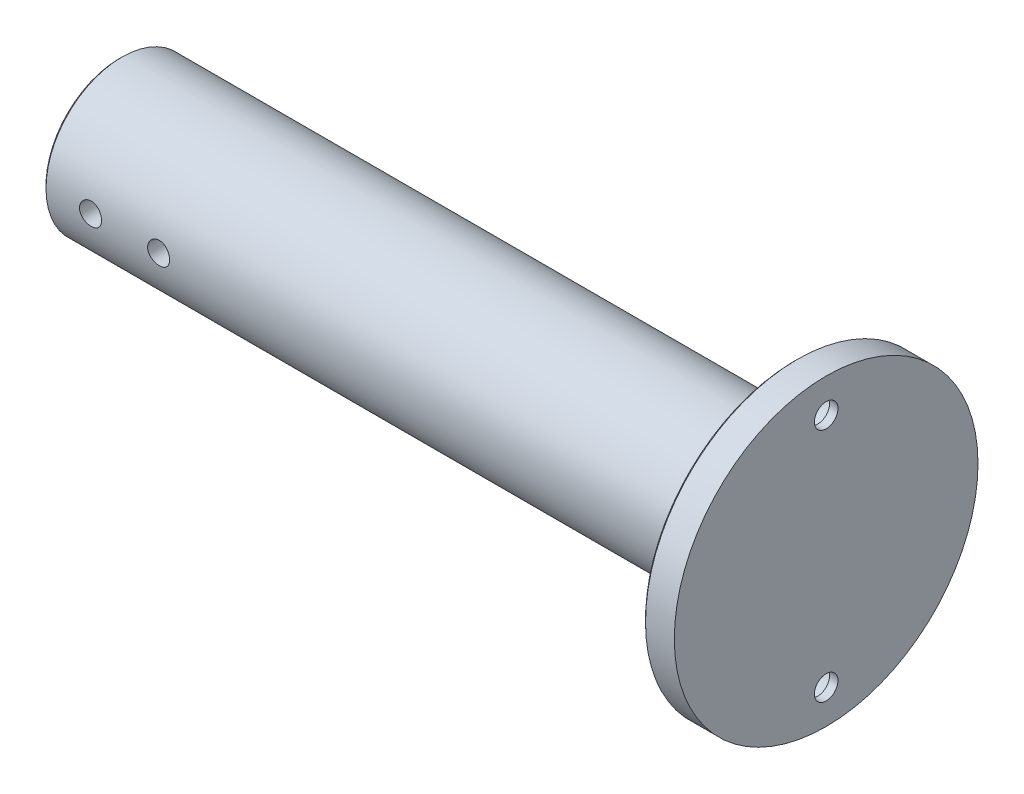
ISO-10303-21;
HEADER;
FILE_DESCRIPTION(('STEP AP214'),'2;1');
FILE_NAME('part.step','',(''),(''),'','','');
FILE_SCHEMA(('AUTOMOTIVE_DESIGN { 1 0 10303 214 1 1 1 1 }'));
ENDSEC;
DATA;
#1=APPLICATION_CONTEXT('core data for automotive mechanical design processes');
#2=APPLICATION_PROTOCOL_DEFINITION('international standard','automotive_design',2000,#1);
#3=PRODUCT_CONTEXT('',#1,'mechanical');
#4=PRODUCT('Part','Part','',(#3));
#5=PRODUCT_RELATED_PRODUCT_CATEGORY('part','',(#4));
#6=PRODUCT_DEFINITION_FORMATION('','',#4);
#7=PRODUCT_DEFINITION_CONTEXT('part definition',#1,'design');
#8=PRODUCT_DEFINITION('design','',#6,#7);
#9=PRODUCT_DEFINITION_SHAPE('','',#8);
#10=(LENGTH_UNIT() NAMED_UNIT(*) SI_UNIT(.MILLI.,.METRE.));
#11=(NAMED_UNIT(*) PLANE_ANGLE_UNIT() SI_UNIT($,.RADIAN.));
#12=(NAMED_UNIT(*) SI_UNIT($,.STERADIAN.) SOLID_ANGLE_UNIT());
#13=UNCERTAINTY_MEASURE_WITH_UNIT(LENGTH_MEASURE(1.E-05),#10,'distance_accuracy_value','');
#14=(GEOMETRIC_REPRESENTATION_CONTEXT(3) GLOBAL_UNCERTAINTY_ASSIGNED_CONTEXT((#13)) GLOBAL_UNIT_ASSIGNED_CONTEXT((#10,
#11,#12)) REPRESENTATION_CONTEXT('',''));
#15=CARTESIAN_POINT('',(0.,0.,0.));
#16=DIRECTION('',(0.,0.,1.));
#17=DIRECTION('',(1.,0.,0.));
#18=AXIS2_PLACEMENT_3D('',#15,#16,#17);
#19=CARTESIAN_POINT('',(0.,0.,0.));
#20=DIRECTION('',(-1.,0.,0.));
#21=DIRECTION('',(0.,0.,1.));
#22=AXIS2_PLACEMENT_3D('',#19,#20,#21);
#23=CYLINDRICAL_SURFACE('',#22,7.);
#24=CARTESIAN_POINT('',(30.,0.,0.));
#25=DIRECTION('',(1.,0.,0.));
#26=DIRECTION('',(0.,0.,-1.));
#27=AXIS2_PLACEMENT_3D('',#24,#25,#26);
#28=CIRCLE('',#27,7.);
#29=CARTESIAN_POINT('',(30.,2.5,6.53834841531101));
#30=VERTEX_POINT('',#29);
#31=CARTESIAN_POINT('',(30.,-2.5,6.53834841531101));
#32=VERTEX_POINT('',#31);
#33=EDGE_CURVE('E92',#30,#32,#28,.T.);
#34=ORIENTED_EDGE('',*,*,#33,.F.);
#35=DIRECTION('',(-1.,0.,0.));
#36=VECTOR('',#35,1.);
#37=CARTESIAN_POINT('',(30.,2.5,6.53834841531101));
#38=LINE('',#37,#36);
#39=CARTESIAN_POINT('',(0.,2.5,6.53834841531101));
#40=VERTEX_POINT('',#39);
#41=EDGE_CURVE('E117',#30,#40,#38,.T.);
#42=ORIENTED_EDGE('',*,*,#41,.T.);
#43=CARTESIAN_POINT('',(0.,0.,0.));
#44=DIRECTION('',(-1.,0.,0.));
#45=DIRECTION('',(0.,0.,1.));
#46=AXIS2_PLACEMENT_3D('',#43,#44,#45);
#47=CIRCLE('',#46,7.);
#48=CARTESIAN_POINT('',(0.,-2.5,6.53834841531101));
#49=VERTEX_POINT('',#48);
#50=EDGE_CURVE('E106',#40,#49,#47,.T.);
#51=ORIENTED_EDGE('',*,*,#50,.T.);
#52=DIRECTION('',(-1.,0.,0.));
#53=VECTOR('',#52,1.);
#54=CARTESIAN_POINT('',(30.,-2.5,6.53834841531101));
#55=LINE('',#54,#53);
#56=EDGE_CURVE('E59',#32,#49,#55,.T.);
#57=ORIENTED_EDGE('',*,*,#56,.F.);
#58=EDGE_LOOP('',(#34,#42,#51,#57));
#59=FACE_BOUND('',#58,.T.);
#60=CARTESIAN_POINT('',(32.,0.,0.));
#61=DIRECTION('',(-1.,0.,0.));
#62=DIRECTION('',(0.,0.,1.));
#63=AXIS2_PLACEMENT_3D('',#60,#61,#62);
#64=CIRCLE('',#63,7.);
#65=CARTESIAN_POINT('',(32.,0.,7.));
#66=VERTEX_POINT('',#65);
#67=EDGE_CURVE('E113',#66,#66,#64,.T.);
#68=ORIENTED_EDGE('',*,*,#67,.F.);
#69=EDGE_LOOP('',(#68));
#70=FACE_BOUND('',#69,.T.);
#71=ADVANCED_FACE('F38',(#59,#70),#23,.F.);
#72=CARTESIAN_POINT('',(0.,7.,0.));
#73=DIRECTION('',(1.,0.,0.));
#74=DIRECTION('',(0.,0.,-1.));
#75=AXIS2_PLACEMENT_3D('',#72,#73,#74);
#76=PLANE('',#75);
#77=CARTESIAN_POINT('',(0.,0.,0.));
#78=DIRECTION('',(1.,0.,0.));
#79=DIRECTION('',(0.,0.,-1.));
#80=AXIS2_PLACEMENT_3D('',#77,#78,#79);
#81=CIRCLE('',#80,14.);
#82=CARTESIAN_POINT('',(0.,0.,-14.));
#83=VERTEX_POINT('',#82);
#84=EDGE_CURVE('E51',#83,#83,#81,.F.);
#85=ORIENTED_EDGE('',*,*,#84,.T.);
#86=EDGE_LOOP('',(#85));
#87=FACE_BOUND('',#86,.T.);
#88=ORIENTED_EDGE('',*,*,#50,.F.);
#89=DIRECTION('',(0.,0.,-1.));
#90=VECTOR('',#89,1.);
#91=CARTESIAN_POINT('',(0.,2.5,6.53834841531101));
#92=LINE('',#91,#90);
#93=CARTESIAN_POINT('',(0.,2.5,9.3));
#94=VERTEX_POINT('',#93);
#95=EDGE_CURVE('E101',#94,#40,#92,.T.);
#96=ORIENTED_EDGE('',*,*,#95,.F.);
#97=DIRECTION('',(0.,1.,0.));
#98=VECTOR('',#97,1.);
#99=CARTESIAN_POINT('',(0.,2.5,9.3));
#100=LINE('',#99,#98);
#101=CARTESIAN_POINT('',(0.,-2.5,9.3));
#102=VERTEX_POINT('',#101);
#103=EDGE_CURVE('E255',#102,#94,#100,.T.);
#104=ORIENTED_EDGE('',*,*,#103,.F.);
#105=DIRECTION('',(0.,0.,1.));
#106=VECTOR('',#105,1.);
#107=CARTESIAN_POINT('',(0.,-2.5,6.53834841531101));
#108=LINE('',#107,#106);
#109=EDGE_CURVE('E160',#49,#102,#108,.T.);
#110=ORIENTED_EDGE('',*,*,#109,.F.);
#111=EDGE_LOOP('',(#88,#96,#104,#110));
#112=FACE_BOUND('',#111,.T.);
#113=ADVANCED_FACE('F214',(#87,#112),#76,.F.);
#114=CARTESIAN_POINT('',(0.,0.,0.));
#115=DIRECTION('',(-1.,0.,0.));
#116=DIRECTION('',(0.,0.,1.));
#117=AXIS2_PLACEMENT_3D('',#114,#115,#116);
#118=CYLINDRICAL_SURFACE('',#117,14.5);
#119=CARTESIAN_POINT('',(11.1,0.,14.5));
#120=CARTESIAN_POINT('',(11.0999951275572,-0.117299613270332,14.4999981660736));
#121=CARTESIAN_POINT('',(11.0901388300823,-0.23466845337473,14.4985616918919));
#122=CARTESIAN_POINT('',(11.0509821928534,-0.46612874531889,14.4929695432408));
#123=CARTESIAN_POINT('',(11.0216626168246,-0.580216838173616,14.4888111786838));
#124=CARTESIAN_POINT('',(10.9444711328522,-0.801732181673342,14.4782428121584));
#125=CARTESIAN_POINT('',(10.8966129096789,-0.909164277915187,14.4718344713926));
#126=CARTESIAN_POINT('',(10.7837353517035,-1.11445541814673,14.4574752908817));
#127=CARTESIAN_POINT('',(10.7187185234473,-1.21231585751398,14.4495246764784));
#128=CARTESIAN_POINT('',(10.5728630974437,-1.39641774437003,14.4329009407888));
#129=CARTESIAN_POINT('',(10.4919239814391,-1.48257916896793,14.4242234416085));
#130=CARTESIAN_POINT('',(10.3167377866319,-1.64014705545175,14.4071584354515));
#131=CARTESIAN_POINT('',(10.2224899631583,-1.71155269114603,14.3987709447345));
#132=CARTESIAN_POINT('',(10.022827717683,-1.83789075681519,14.3831930506778));
#133=CARTESIAN_POINT('',(9.91736415206087,-1.89274627894392,14.3760083031656));
#134=CARTESIAN_POINT('',(9.69859929764127,-1.98393556632179,14.3637087777007));
#135=CARTESIAN_POINT('',(9.58529840720676,-2.02027027217996,14.3585938946294));
#136=CARTESIAN_POINT('',(9.35491450948957,-2.07313910873064,14.3510560435368));
#137=CARTESIAN_POINT('',(9.23786347371861,-2.08980986517223,14.3486145096159));
#138=CARTESIAN_POINT('',(9.00260179321826,-2.10330072907034,14.3466433490983));
#139=CARTESIAN_POINT('',(8.88439121096332,-2.10012190018772,14.3471135664724));
#140=CARTESIAN_POINT('',(8.65112824724246,-2.07411559063177,14.3508957977387));
#141=CARTESIAN_POINT('',(8.53605853521923,-2.05143990441475,14.3541858568831));
#142=CARTESIAN_POINT('',(8.31137462795344,-1.98732100540721,14.3632027837136));
#143=CARTESIAN_POINT('',(8.20176057752362,-1.94587729474084,14.3689297160446));
#144=CARTESIAN_POINT('',(7.99063554014074,-1.84523974296827,14.3821995060398));
#145=CARTESIAN_POINT('',(7.88915580814736,-1.78598123809014,14.3897489590468));
#146=CARTESIAN_POINT('',(7.69752298511232,-1.65144232517843,14.4058083242372));
#147=CARTESIAN_POINT('',(7.60737058829275,-1.57616093590606,14.4143182952277));
#148=CARTESIAN_POINT('',(7.44007148894477,-1.41087821383593,14.4314369801912));
#149=CARTESIAN_POINT('',(7.36305375539077,-1.32074629825182,14.4400458755576));
#150=CARTESIAN_POINT('',(7.22521880647849,-1.12876709993728,14.4563186729003));
#151=CARTESIAN_POINT('',(7.1644016536433,-1.02691977199559,14.4639825712296));
#152=CARTESIAN_POINT('',(7.06068906522607,-0.814291764442148,14.4775090984612));
#153=CARTESIAN_POINT('',(7.01780316447181,-0.703506369325372,14.4833707686031));
#154=CARTESIAN_POINT('',(6.95128040873683,-0.47620239154794,14.4926242487035));
#155=CARTESIAN_POINT('',(6.9276423414137,-0.359684170464868,14.4960162142172));
#156=CARTESIAN_POINT('',(6.9004567819414,-0.125335604900574,14.4999275875031));
#157=CARTESIAN_POINT('',(6.89673190622403,-0.00752624522528646,14.500472356672));
#158=CARTESIAN_POINT('',(6.90900823510813,0.227035329333205,14.4986968687047));
#159=CARTESIAN_POINT('',(6.92500887157522,0.343787574565868,14.4963766940845));
#160=CARTESIAN_POINT('',(6.97613454686024,0.572386528792875,14.489147713708));
#161=CARTESIAN_POINT('',(7.01117357225349,0.684252874322393,14.4842505536124));
#162=CARTESIAN_POINT('',(7.09929097510943,0.900522807854554,14.4724151045888));
#163=CARTESIAN_POINT('',(7.15237014952721,1.00492606591561,14.4654767254882));
#164=CARTESIAN_POINT('',(7.27548015466707,1.20408891460967,14.4502673157442));
#165=CARTESIAN_POINT('',(7.34562400020878,1.29877796574594,14.4419875287991));
#166=CARTESIAN_POINT('',(7.50071431934693,1.47510343140294,14.4250452595269));
#167=CARTESIAN_POINT('',(7.58566159199609,1.55673914087991,14.4163827565605));
#168=CARTESIAN_POINT('',(7.76873531598681,1.70528248409736,14.3995714266397));
#169=CARTESIAN_POINT('',(7.86695848978308,1.77207149526099,14.3914270838224));
#170=CARTESIAN_POINT('',(8.07333353635115,1.88820213692189,14.3766523959015));
#171=CARTESIAN_POINT('',(8.18148515531277,1.93754421327522,14.3700220121103));
#172=CARTESIAN_POINT('',(8.40428693811768,2.01719466458259,14.3590580349442));
#173=CARTESIAN_POINT('',(8.51891404173257,2.0475664464087,14.3547167979207));
#174=CARTESIAN_POINT('',(8.75170932656402,2.08861654390681,14.3488019811722));
#175=CARTESIAN_POINT('',(8.86987728070567,2.09929611970574,14.3472282243531));
#176=CARTESIAN_POINT('',(9.10521810947313,2.10063018476802,14.3470328580372));
#177=CARTESIAN_POINT('',(9.22238994709194,2.09147114557779,14.348383758391));
#178=CARTESIAN_POINT('',(9.45350859749891,2.05378652523396,14.3538258929226));
#179=CARTESIAN_POINT('',(9.56745541409593,2.02526096695393,14.3579171238639));
#180=CARTESIAN_POINT('',(9.78884377137152,1.94971733785975,14.3683695747595));
#181=CARTESIAN_POINT('',(9.89628953205976,1.90271141502776,14.3747293032735));
#182=CARTESIAN_POINT('',(10.1017995426309,1.79155983241603,14.389004111718));
#183=CARTESIAN_POINT('',(10.1998635183729,1.72741367199679,14.3969192370776));
#184=CARTESIAN_POINT('',(10.3847750867278,1.58312168952411,14.413501720915));
#185=CARTESIAN_POINT('',(10.4715141943607,1.50283753040839,14.4221751892996));
#186=CARTESIAN_POINT('',(10.6303560357212,1.32884060733831,14.4392454083916));
#187=CARTESIAN_POINT('',(10.7024553535092,1.23512471800565,14.4476420941348));
#188=CARTESIAN_POINT('',(10.8302976268808,1.03636307286061,14.4632614439816));
#189=CARTESIAN_POINT('',(10.8859550450137,0.931261823785198,14.470477884142));
#190=CARTESIAN_POINT('',(10.9787453209441,0.713150267980082,14.4828623200179));
#191=CARTESIAN_POINT('',(11.0158975749304,0.600148384621874,14.488032459391));
#192=CARTESIAN_POINT('',(11.0620906821452,0.405517989833761,14.4945468165987));
#193=CARTESIAN_POINT('',(11.0762852422256,0.32509706575113,14.49658137891));
#194=CARTESIAN_POINT('',(11.0952415427288,0.163128581272512,14.4993086008408));
#195=CARTESIAN_POINT('',(11.1000033887487,0.0815810334991175,14.5000012754825));
#196=CARTESIAN_POINT('',(11.1,0.,14.5));
#197=B_SPLINE_CURVE_WITH_KNOTS('',3,(#119,#120,#121,#122,#123,#124,#125,#126,#127,#128,#129,
#130,#131,#132,#133,#134,#135,#136,#137,#138,#139,#140,#141,#142,#143,#144,#145,#146,#147,#148,
#149,#150,#151,#152,#153,#154,#155,#156,#157,#158,#159,#160,#161,#162,#163,#164,#165,#166,#167,
#168,#169,#170,#171,#172,#173,#174,#175,#176,#177,#178,#179,#180,#181,#182,#183,#184,#185,#186,
#187,#188,#189,#190,#191,#192,#193,#194,#195,#196),.UNSPECIFIED.,.T.,.F.,(4,2,2,2,2,2,2,2,2,2,2,
2,2,2,2,2,2,2,2,2,2,2,2,2,2,2,2,2,2,2,2,2,2,2,2,2,2,2,4),(0.,0.351600760363764,
0.703549539107828,1.05523901154347,1.40687713724447,1.76081086052436,2.11476439554727,
2.47033826754526,2.82589407936064,3.17896464735107,3.53201629584703,3.8823438658922,
4.23268072992844,4.5843049165824,4.93595064284241,5.29087191260946,5.64579455210848,
6.00090568015259,6.35599443946658,6.70791478822976,7.05982500121662,7.41015838316317,
7.76050724371122,8.1132427495233,8.46599730103469,8.82147636365635,9.1769463413611,
9.53122173680014,9.88547446096189,10.2364118733449,10.5873488712409,10.9380555669998,
11.2887725074718,11.6426349385295,11.9965798425742,12.3523349326982,12.7077163492759,
12.9522548752411,13.1967906636366),.UNSPECIFIED.);
#198=CARTESIAN_POINT('',(11.1,0.,14.5));
#199=VERTEX_POINT('',#198);
#200=EDGE_CURVE('E42',#199,#199,#197,.T.);
#201=ORIENTED_EDGE('',*,*,#200,.T.);
#202=EDGE_LOOP('',(#201));
#203=FACE_BOUND('',#202,.T.);
#204=CARTESIAN_POINT('',(24.1,0.,14.5));
#205=CARTESIAN_POINT('',(24.0999951275572,-0.117299613270333,14.4999981660736));
#206=CARTESIAN_POINT('',(24.0901388300823,-0.23466845337473,14.4985616918919));
#207=CARTESIAN_POINT('',(24.0509821928534,-0.466128745318891,14.4929695432408));
#208=CARTESIAN_POINT('',(24.0216626168246,-0.580216838173617,14.4888111786838));
#209=CARTESIAN_POINT('',(23.9444711328522,-0.801732181673344,14.4782428121584));
#210=CARTESIAN_POINT('',(23.8966129096789,-0.909164277915188,14.4718344713926));
#211=CARTESIAN_POINT('',(23.7837353517035,-1.11445541814673,14.4574752908817));
#212=CARTESIAN_POINT('',(23.7187185234473,-1.21231585751398,14.4495246764784));
#213=CARTESIAN_POINT('',(23.5728630974436,-1.39641774437003,14.4329009407888));
#214=CARTESIAN_POINT('',(23.4919239814391,-1.48257916896793,14.4242234416085));
#215=CARTESIAN_POINT('',(23.3167377866319,-1.64014705545175,14.4071584354515));
#216=CARTESIAN_POINT('',(23.2224899631583,-1.71155269114603,14.3987709447345));
#217=CARTESIAN_POINT('',(23.022827717683,-1.83789075681519,14.3831930506778));
#218=CARTESIAN_POINT('',(22.9173641520609,-1.89274627894392,14.3760083031656));
#219=CARTESIAN_POINT('',(22.6985992976413,-1.98393556632179,14.3637087777007));
#220=CARTESIAN_POINT('',(22.5852984072068,-2.02027027217996,14.3585938946294));
#221=CARTESIAN_POINT('',(22.3549145094896,-2.07313910873064,14.3510560435368));
#222=CARTESIAN_POINT('',(22.2378634737186,-2.08980986517223,14.3486145096159));
#223=CARTESIAN_POINT('',(22.0026017932183,-2.10330072907035,14.3466433490983));
#224=CARTESIAN_POINT('',(21.8843912109633,-2.10012190018772,14.3471135664724));
#225=CARTESIAN_POINT('',(21.6511282472425,-2.07411559063177,14.3508957977387));
#226=CARTESIAN_POINT('',(21.5360585352192,-2.05143990441475,14.3541858568831));
#227=CARTESIAN_POINT('',(21.3113746279534,-1.98732100540721,14.3632027837136));
#228=CARTESIAN_POINT('',(21.2017605775236,-1.94587729474084,14.3689297160446));
#229=CARTESIAN_POINT('',(20.9906355401407,-1.84523974296827,14.3821995060399));
#230=CARTESIAN_POINT('',(20.8891558081474,-1.78598123809014,14.3897489590468));
#231=CARTESIAN_POINT('',(20.6975229851123,-1.65144232517843,14.4058083242372));
#232=CARTESIAN_POINT('',(20.6073705882927,-1.57616093590606,14.4143182952277));
#233=CARTESIAN_POINT('',(20.4400714889448,-1.41087821383593,14.4314369801912));
#234=CARTESIAN_POINT('',(20.3630537553908,-1.32074629825182,14.4400458755576));
#235=CARTESIAN_POINT('',(20.2252188064785,-1.12876709993728,14.4563186729003));
#236=CARTESIAN_POINT('',(20.1644016536433,-1.02691977199559,14.4639825712296));
#237=CARTESIAN_POINT('',(20.0606890652261,-0.814291764442148,14.4775090984612));
#238=CARTESIAN_POINT('',(20.0178031644718,-0.703506369325374,14.4833707686031));
#239=CARTESIAN_POINT('',(19.9512804087368,-0.476202391547942,14.4926242487035));
#240=CARTESIAN_POINT('',(19.9276423414137,-0.359684170464869,14.4960162142172));
#241=CARTESIAN_POINT('',(19.9004567819414,-0.125335604900574,14.4999275875031));
#242=CARTESIAN_POINT('',(19.896731906224,-0.00752624522528647,14.500472356672));
#243=CARTESIAN_POINT('',(19.9090082351081,0.227035329333206,14.4986968687047));
#244=CARTESIAN_POINT('',(19.9250088715752,0.343787574565869,14.4963766940845));
#245=CARTESIAN_POINT('',(19.9761345468602,0.572386528792877,14.489147713708));
#246=CARTESIAN_POINT('',(20.0111735722535,0.684252874322394,14.4842505536124));
#247=CARTESIAN_POINT('',(20.0992909751094,0.900522807854556,14.4724151045888));
#248=CARTESIAN_POINT('',(20.1523701495272,1.00492606591561,14.4654767254882));
#249=CARTESIAN_POINT('',(20.2754801546671,1.20408891460968,14.4502673157442));
#250=CARTESIAN_POINT('',(20.3456240002088,1.29877796574594,14.4419875287991));
#251=CARTESIAN_POINT('',(20.5007143193469,1.47510343140294,14.4250452595269));
#252=CARTESIAN_POINT('',(20.5856615919961,1.55673914087992,14.4163827565605));
#253=CARTESIAN_POINT('',(20.7687353159868,1.70528248409736,14.3995714266397));
#254=CARTESIAN_POINT('',(20.8669584897831,1.77207149526099,14.3914270838224));
#255=CARTESIAN_POINT('',(21.0733335363512,1.88820213692189,14.3766523959015));
#256=CARTESIAN_POINT('',(21.1814851553128,1.93754421327523,14.3700220121103));
#257=CARTESIAN_POINT('',(21.4042869381177,2.01719466458259,14.3590580349442));
#258=CARTESIAN_POINT('',(21.5189140417326,2.04756644640871,14.3547167979207));
#259=CARTESIAN_POINT('',(21.751709326564,2.08861654390681,14.3488019811722));
#260=CARTESIAN_POINT('',(21.8698772807057,2.09929611970574,14.3472282243531));
#261=CARTESIAN_POINT('',(22.1052181094731,2.10063018476802,14.3470328580372));
#262=CARTESIAN_POINT('',(22.2223899470919,2.09147114557779,14.348383758391));
#263=CARTESIAN_POINT('',(22.4535085974989,2.05378652523396,14.3538258929226));
#264=CARTESIAN_POINT('',(22.5674554140959,2.02526096695393,14.3579171238639));
#265=CARTESIAN_POINT('',(22.7888437713715,1.94971733785975,14.3683695747595));
#266=CARTESIAN_POINT('',(22.8962895320598,1.90271141502776,14.3747293032735));
#267=CARTESIAN_POINT('',(23.1017995426309,1.79155983241603,14.389004111718));
#268=CARTESIAN_POINT('',(23.1998635183729,1.7274136719968,14.3969192370776));
#269=CARTESIAN_POINT('',(23.3847750867278,1.58312168952411,14.413501720915));
#270=CARTESIAN_POINT('',(23.4715141943607,1.50283753040839,14.4221751892996));
#271=CARTESIAN_POINT('',(23.6303560357212,1.32884060733831,14.4392454083916));
#272=CARTESIAN_POINT('',(23.7024553535092,1.23512471800565,14.4476420941348));
#273=CARTESIAN_POINT('',(23.8302976268808,1.03636307286061,14.4632614439816));
#274=CARTESIAN_POINT('',(23.8859550450137,0.931261823785199,14.470477884142));
#275=CARTESIAN_POINT('',(23.9787453209441,0.713150267980082,14.4828623200179));
#276=CARTESIAN_POINT('',(24.0158975749304,0.600148384621874,14.488032459391));
#277=CARTESIAN_POINT('',(24.0620906821452,0.405517989833761,14.4945468165987));
#278=CARTESIAN_POINT('',(24.0762852422256,0.32509706575113,14.49658137891));
#279=CARTESIAN_POINT('',(24.0952415427288,0.163128581272512,14.4993086008408));
#280=CARTESIAN_POINT('',(24.1000033887487,0.0815810334991175,14.5000012754825));
#281=CARTESIAN_POINT('',(24.1,0.,14.5));
#282=B_SPLINE_CURVE_WITH_KNOTS('',3,(#204,#205,#206,#207,#208,#209,#210,#211,#212,#213,#214,
#215,#216,#217,#218,#219,#220,#221,#222,#223,#224,#225,#226,#227,#228,#229,#230,#231,#232,#233,
#234,#235,#236,#237,#238,#239,#240,#241,#242,#243,#244,#245,#246,#247,#248,#249,#250,#251,#252,
#253,#254,#255,#256,#257,#258,#259,#260,#261,#262,#263,#264,#265,#266,#267,#268,#269,#270,#271,
#272,#273,#274,#275,#276,#277,#278,#279,#280,#281),.UNSPECIFIED.,.T.,.F.,(4,2,2,2,2,2,2,2,2,2,2,
2,2,2,2,2,2,2,2,2,2,2,2,2,2,2,2,2,2,2,2,2,2,2,2,2,2,2,4),(0.,0.351600760363765,
0.703549539107828,1.05523901154347,1.40687713724447,1.76081086052437,2.11476439554726,
2.47033826754526,2.82589407936064,3.17896464735107,3.53201629584704,3.88234386589221,
4.23268072992844,4.58430491658241,4.93595064284242,5.29087191260946,5.64579455210849,
6.00090568015259,6.35599443946658,6.70791478822977,7.05982500121662,7.41015838316317,
7.76050724371122,8.1132427495233,8.46599730103469,8.82147636365636,9.17694634136111,
9.53122173680014,9.8854744609619,10.2364118733449,10.5873488712409,10.9380555669998,
11.2887725074718,11.6426349385295,11.9965798425742,12.3523349326982,12.707716349276,
12.9522548752411,13.1967906636366),.UNSPECIFIED.);
#283=CARTESIAN_POINT('',(24.1,0.,14.5));
#284=VERTEX_POINT('',#283);
#285=EDGE_CURVE('E155',#284,#284,#282,.T.);
#286=ORIENTED_EDGE('',*,*,#285,.T.);
#287=EDGE_LOOP('',(#286));
#288=FACE_BOUND('',#287,.T.);
#289=CARTESIAN_POINT('',(0.500000000000032,0.,0.));
#290=DIRECTION('',(1.,0.,0.));
#291=DIRECTION('',(0.,0.,-1.));
#292=AXIS2_PLACEMENT_3D('',#289,#290,#291);
#293=CIRCLE('',#292,14.5);
#294=CARTESIAN_POINT('',(0.500000000000032,0.,-14.5));
#295=VERTEX_POINT('',#294);
#296=EDGE_CURVE('E12',#295,#295,#293,.T.);
#297=ORIENTED_EDGE('',*,*,#296,.T.);
#298=EDGE_LOOP('',(#297));
#299=FACE_BOUND('',#298,.T.);
#300=CARTESIAN_POINT('',(129.,0.,0.));
#301=DIRECTION('',(-1.,0.,0.));
#302=DIRECTION('',(0.,0.,1.));
#303=AXIS2_PLACEMENT_3D('',#300,#301,#302);
#304=CIRCLE('',#303,14.5);
#305=CARTESIAN_POINT('',(129.,0.,14.5));
#306=VERTEX_POINT('',#305);
#307=EDGE_CURVE('E145',#306,#306,#304,.T.);
#308=ORIENTED_EDGE('',*,*,#307,.T.);
#309=EDGE_LOOP('',(#308));
#310=FACE_BOUND('',#309,.T.);
#311=ADVANCED_FACE('F162',(#203,#288,#299,#310),#118,.T.);
#312=CARTESIAN_POINT('',(129.,14.5,0.));
#313=DIRECTION('',(1.,0.,0.));
#314=DIRECTION('',(0.,0.,-1.));
#315=AXIS2_PLACEMENT_3D('',#312,#313,#314);
#316=PLANE('',#315);
#317=CARTESIAN_POINT('',(129.,-22.5,0.));
#318=DIRECTION('',(-1.,0.,0.));
#319=DIRECTION('',(0.,0.,1.));
#320=AXIS2_PLACEMENT_3D('',#317,#318,#319);
#321=CIRCLE('',#320,3.99999999999999);
#322=CARTESIAN_POINT('',(129.,-22.5,3.99999999999999));
#323=VERTEX_POINT('',#322);
#324=EDGE_CURVE('E116',#323,#323,#321,.T.);
#325=ORIENTED_EDGE('',*,*,#324,.F.);
#326=EDGE_LOOP('',(#325));
#327=FACE_BOUND('',#326,.T.);
#328=CARTESIAN_POINT('',(129.,22.5,0.));
#329=DIRECTION('',(-1.,0.,0.));
#330=DIRECTION('',(0.,0.,1.));
#331=AXIS2_PLACEMENT_3D('',#328,#329,#330);
#332=CIRCLE('',#331,3.99999999999999);
#333=CARTESIAN_POINT('',(129.,22.5,4.));
#334=VERTEX_POINT('',#333);
#335=EDGE_CURVE('E129',#334,#334,#332,.T.);
#336=ORIENTED_EDGE('',*,*,#335,.F.);
#337=EDGE_LOOP('',(#336));
#338=FACE_BOUND('',#337,.T.);
#339=CARTESIAN_POINT('',(129.,0.,0.));
#340=DIRECTION('',(1.,0.,0.));
#341=DIRECTION('',(0.,0.,-1.));
#342=AXIS2_PLACEMENT_3D('',#339,#340,#341);
#343=CIRCLE('',#342,28.4999999999999);
#344=CARTESIAN_POINT('',(129.,0.,-28.4999999999999));
#345=VERTEX_POINT('',#344);
#346=EDGE_CURVE('E148',#345,#345,#343,.F.);
#347=ORIENTED_EDGE('',*,*,#346,.T.);
#348=EDGE_LOOP('',(#347));
#349=FACE_BOUND('',#348,.T.);
#350=ORIENTED_EDGE('',*,*,#307,.F.);
#351=EDGE_LOOP('',(#350));
#352=FACE_BOUND('',#351,.T.);
#353=ADVANCED_FACE('F222',(#327,#338,#349,#352),#316,.F.);
#354=CARTESIAN_POINT('',(0.,0.,0.));
#355=DIRECTION('',(-1.,0.,0.));
#356=DIRECTION('',(0.,0.,1.));
#357=AXIS2_PLACEMENT_3D('',#354,#355,#356);
#358=CYLINDRICAL_SURFACE('',#357,29.);
#359=CARTESIAN_POINT('',(129.5,0.,0.));
#360=DIRECTION('',(1.,0.,0.));
#361=DIRECTION('',(0.,0.,-1.));
#362=AXIS2_PLACEMENT_3D('',#359,#360,#361);
#363=CIRCLE('',#362,29.);
#364=CARTESIAN_POINT('',(129.5,0.,-29.));
#365=VERTEX_POINT('',#364);
#366=EDGE_CURVE('E151',#365,#365,#363,.T.);
#367=ORIENTED_EDGE('',*,*,#366,.T.);
#368=EDGE_LOOP('',(#367));
#369=FACE_BOUND('',#368,.T.);
#370=CARTESIAN_POINT('',(135.,0.,0.));
#371=DIRECTION('',(-1.,0.,0.));
#372=DIRECTION('',(0.,0.,1.));
#373=AXIS2_PLACEMENT_3D('',#370,#371,#372);
#374=CIRCLE('',#373,29.);
#375=CARTESIAN_POINT('',(135.,0.,29.));
#376=VERTEX_POINT('',#375);
#377=EDGE_CURVE('E142',#376,#376,#374,.T.);
#378=ORIENTED_EDGE('',*,*,#377,.T.);
#379=EDGE_LOOP('',(#378));
#380=FACE_BOUND('',#379,.T.);
#381=ADVANCED_FACE('F219',(#369,#380),#358,.T.);
#382=CARTESIAN_POINT('',(135.,29.,0.));
#383=DIRECTION('',(-1.,0.,0.));
#384=DIRECTION('',(0.,0.,1.));
#385=AXIS2_PLACEMENT_3D('',#382,#383,#384);
#386=PLANE('',#385);
#387=CARTESIAN_POINT('',(135.,-22.5,0.));
#388=DIRECTION('',(-1.,0.,0.));
#389=DIRECTION('',(0.,0.,1.));
#390=AXIS2_PLACEMENT_3D('',#387,#388,#389);
#391=CIRCLE('',#390,2.25);
#392=CARTESIAN_POINT('',(135.,-22.5,2.25));
#393=VERTEX_POINT('',#392);
#394=EDGE_CURVE('E126',#393,#393,#391,.T.);
#395=ORIENTED_EDGE('',*,*,#394,.T.);
#396=EDGE_LOOP('',(#395));
#397=FACE_BOUND('',#396,.T.);
#398=CARTESIAN_POINT('',(135.,22.5,0.));
#399=DIRECTION('',(-1.,0.,0.));
#400=DIRECTION('',(0.,0.,1.));
#401=AXIS2_PLACEMENT_3D('',#398,#399,#400);
#402=CIRCLE('',#401,2.25);
#403=CARTESIAN_POINT('',(135.,22.5,2.25));
#404=VERTEX_POINT('',#403);
#405=EDGE_CURVE('E138',#404,#404,#402,.T.);
#406=ORIENTED_EDGE('',*,*,#405,.T.);
#407=EDGE_LOOP('',(#406));
#408=FACE_BOUND('',#407,.T.);
#409=ORIENTED_EDGE('',*,*,#377,.F.);
#410=EDGE_LOOP('',(#409));
#411=FACE_BOUND('',#410,.T.);
#412=ADVANCED_FACE('F215',(#397,#408,#411),#386,.F.);
#413=CARTESIAN_POINT('',(129.,0.,0.));
#414=DIRECTION('',(1.,0.,0.));
#415=DIRECTION('',(0.,0.,-1.));
#416=AXIS2_PLACEMENT_3D('',#413,#414,#415);
#417=CONICAL_SURFACE('',#416,28.4999999999999,0.785398163397448);
#418=ORIENTED_EDGE('',*,*,#366,.F.);
#419=EDGE_LOOP('',(#418));
#420=FACE_BOUND('',#419,.T.);
#421=ORIENTED_EDGE('',*,*,#346,.F.);
#422=EDGE_LOOP('',(#421));
#423=FACE_BOUND('',#422,.T.);
#424=ADVANCED_FACE('F218',(#420,#423),#417,.T.);
#425=CARTESIAN_POINT('',(0.,0.,0.));
#426=DIRECTION('',(1.,0.,0.));
#427=DIRECTION('',(0.,0.,-1.));
#428=AXIS2_PLACEMENT_3D('',#425,#426,#427);
#429=CONICAL_SURFACE('',#428,14.,0.785398163397427);
#430=ORIENTED_EDGE('',*,*,#296,.F.);
#431=EDGE_LOOP('',(#430));
#432=FACE_BOUND('',#431,.T.);
#433=ORIENTED_EDGE('',*,*,#84,.F.);
#434=EDGE_LOOP('',(#433));
#435=FACE_BOUND('',#434,.T.);
#436=ADVANCED_FACE('F40',(#432,#435),#429,.T.);
#437=CARTESIAN_POINT('',(129.,22.5,0.));
#438=DIRECTION('',(-1.,0.,0.));
#439=DIRECTION('',(0.,0.,1.));
#440=AXIS2_PLACEMENT_3D('',#437,#438,#439);
#441=CYLINDRICAL_SURFACE('',#440,2.25);
#442=ORIENTED_EDGE('',*,*,#405,.F.);
#443=EDGE_LOOP('',(#442));
#444=FACE_BOUND('',#443,.T.);
#445=CARTESIAN_POINT('',(133.4,22.5,0.));
#446=DIRECTION('',(-1.,0.,0.));
#447=DIRECTION('',(0.,0.,1.));
#448=AXIS2_PLACEMENT_3D('',#445,#446,#447);
#449=CIRCLE('',#448,2.25);
#450=CARTESIAN_POINT('',(133.4,22.5,2.25));
#451=VERTEX_POINT('',#450);
#452=EDGE_CURVE('E135',#451,#451,#449,.T.);
#453=ORIENTED_EDGE('',*,*,#452,.T.);
#454=EDGE_LOOP('',(#453));
#455=FACE_BOUND('',#454,.T.);
#456=ADVANCED_FACE('F207',(#444,#455),#441,.F.);
#457=CARTESIAN_POINT('',(133.4,24.75,0.));
#458=DIRECTION('',(1.,0.,0.));
#459=DIRECTION('',(0.,0.,-1.));
#460=AXIS2_PLACEMENT_3D('',#457,#458,#459);
#461=PLANE('',#460);
#462=ORIENTED_EDGE('',*,*,#452,.F.);
#463=EDGE_LOOP('',(#462));
#464=FACE_BOUND('',#463,.T.);
#465=CARTESIAN_POINT('',(133.4,22.5,0.));
#466=DIRECTION('',(-1.,0.,0.));
#467=DIRECTION('',(0.,0.,1.));
#468=AXIS2_PLACEMENT_3D('',#465,#466,#467);
#469=CIRCLE('',#468,4.);
#470=CARTESIAN_POINT('',(133.4,22.5,4.));
#471=VERTEX_POINT('',#470);
#472=EDGE_CURVE('E132',#471,#471,#469,.T.);
#473=ORIENTED_EDGE('',*,*,#472,.T.);
#474=EDGE_LOOP('',(#473));
#475=FACE_BOUND('',#474,.T.);
#476=ADVANCED_FACE('F203',(#464,#475),#461,.F.);
#477=CARTESIAN_POINT('',(129.,22.5,0.));
#478=DIRECTION('',(-1.,0.,0.));
#479=DIRECTION('',(0.,0.,1.));
#480=AXIS2_PLACEMENT_3D('',#477,#478,#479);
#481=CYLINDRICAL_SURFACE('',#480,3.99999999999999);
#482=ORIENTED_EDGE('',*,*,#472,.F.);
#483=EDGE_LOOP('',(#482));
#484=FACE_BOUND('',#483,.T.);
#485=ORIENTED_EDGE('',*,*,#335,.T.);
#486=EDGE_LOOP('',(#485));
#487=FACE_BOUND('',#486,.T.);
#488=ADVANCED_FACE('F199',(#484,#487),#481,.F.);
#489=CARTESIAN_POINT('',(129.,-22.5,0.));
#490=DIRECTION('',(-1.,0.,0.));
#491=DIRECTION('',(0.,0.,1.));
#492=AXIS2_PLACEMENT_3D('',#489,#490,#491);
#493=CYLINDRICAL_SURFACE('',#492,2.25);
#494=ORIENTED_EDGE('',*,*,#394,.F.);
#495=EDGE_LOOP('',(#494));
#496=FACE_BOUND('',#495,.T.);
#497=CARTESIAN_POINT('',(133.4,-22.5,0.));
#498=DIRECTION('',(-1.,0.,0.));
#499=DIRECTION('',(0.,0.,1.));
#500=AXIS2_PLACEMENT_3D('',#497,#498,#499);
#501=CIRCLE('',#500,2.25);
#502=CARTESIAN_POINT('',(133.4,-22.5,2.25));
#503=VERTEX_POINT('',#502);
#504=EDGE_CURVE('E123',#503,#503,#501,.T.);
#505=ORIENTED_EDGE('',*,*,#504,.T.);
#506=EDGE_LOOP('',(#505));
#507=FACE_BOUND('',#506,.T.);
#508=ADVANCED_FACE('F195',(#496,#507),#493,.F.);
#509=CARTESIAN_POINT('',(133.4,-20.25,0.));
#510=DIRECTION('',(1.,0.,0.));
#511=DIRECTION('',(0.,0.,-1.));
#512=AXIS2_PLACEMENT_3D('',#509,#510,#511);
#513=PLANE('',#512);
#514=ORIENTED_EDGE('',*,*,#504,.F.);
#515=EDGE_LOOP('',(#514));
#516=FACE_BOUND('',#515,.T.);
#517=CARTESIAN_POINT('',(133.4,-22.5,0.));
#518=DIRECTION('',(-1.,0.,0.));
#519=DIRECTION('',(0.,0.,1.));
#520=AXIS2_PLACEMENT_3D('',#517,#518,#519);
#521=CIRCLE('',#520,4.);
#522=CARTESIAN_POINT('',(133.4,-22.5,3.99999999999999));
#523=VERTEX_POINT('',#522);
#524=EDGE_CURVE('E120',#523,#523,#521,.T.);
#525=ORIENTED_EDGE('',*,*,#524,.T.);
#526=EDGE_LOOP('',(#525));
#527=FACE_BOUND('',#526,.T.);
#528=ADVANCED_FACE('F191',(#516,#527),#513,.F.);
#529=CARTESIAN_POINT('',(129.,-22.5,0.));
#530=DIRECTION('',(-1.,0.,0.));
#531=DIRECTION('',(0.,0.,1.));
#532=AXIS2_PLACEMENT_3D('',#529,#530,#531);
#533=CYLINDRICAL_SURFACE('',#532,3.99999999999999);
#534=ORIENTED_EDGE('',*,*,#524,.F.);
#535=EDGE_LOOP('',(#534));
#536=FACE_BOUND('',#535,.T.);
#537=ORIENTED_EDGE('',*,*,#324,.T.);
#538=EDGE_LOOP('',(#537));
#539=FACE_BOUND('',#538,.T.);
#540=ADVANCED_FACE('F188',(#536,#539),#533,.F.);
#541=CARTESIAN_POINT('',(32.,0.,0.));
#542=DIRECTION('',(-1.,0.,0.));
#543=DIRECTION('',(0.,0.,1.));
#544=AXIS2_PLACEMENT_3D('',#541,#542,#543);
#545=CONICAL_SURFACE('',#544,7.,1.0471975511966);
#546=CARTESIAN_POINT('',(36.0414518843274,0.,0.));
#547=VERTEX_POINT('',#546);
#548=VERTEX_LOOP('',#547);
#549=FACE_BOUND('',#548,.T.);
#550=ORIENTED_EDGE('',*,*,#67,.T.);
#551=EDGE_LOOP('',(#550));
#552=FACE_BOUND('',#551,.T.);
#553=ADVANCED_FACE('F179',(#549,#552),#545,.F.);
#554=CARTESIAN_POINT('',(30.,2.5,6.53834841531101));
#555=DIRECTION('',(0.,1.,0.));
#556=DIRECTION('',(0.,0.,1.));
#557=AXIS2_PLACEMENT_3D('',#554,#555,#556);
#558=PLANE('',#557);
#559=ORIENTED_EDGE('',*,*,#95,.T.);
#560=ORIENTED_EDGE('',*,*,#41,.F.);
#561=DIRECTION('',(0.,0.,-1.));
#562=VECTOR('',#561,1.);
#563=CARTESIAN_POINT('',(30.,2.5,6.53834841531101));
#564=LINE('',#563,#562);
#565=CARTESIAN_POINT('',(30.,2.5,9.3));
#566=VERTEX_POINT('',#565);
#567=EDGE_CURVE('E98',#566,#30,#564,.T.);
#568=ORIENTED_EDGE('',*,*,#567,.F.);
#569=DIRECTION('',(-1.,0.,0.));
#570=VECTOR('',#569,1.);
#571=CARTESIAN_POINT('',(30.,2.5,9.3));
#572=LINE('',#571,#570);
#573=EDGE_CURVE('E108',#566,#94,#572,.T.);
#574=ORIENTED_EDGE('',*,*,#573,.T.);
#575=EDGE_LOOP('',(#559,#560,#568,#574));
#576=FACE_BOUND('',#575,.T.);
#577=ADVANCED_FACE('F175',(#576),#558,.F.);
#578=CARTESIAN_POINT('',(30.,2.5,9.3));
#579=DIRECTION('',(0.,0.,1.));
#580=DIRECTION('',(1.,0.,0.));
#581=AXIS2_PLACEMENT_3D('',#578,#579,#580);
#582=PLANE('',#581);
#583=CARTESIAN_POINT('',(9.,0.,9.3));
#584=DIRECTION('',(0.,0.,-1.));
#585=DIRECTION('',(-1.,0.,0.));
#586=AXIS2_PLACEMENT_3D('',#583,#584,#585);
#587=CIRCLE('',#586,2.09999999999999);
#588=CARTESIAN_POINT('',(6.90000000000001,0.,9.3));
#589=VERTEX_POINT('',#588);
#590=EDGE_CURVE('E265',#589,#589,#587,.T.);
#591=ORIENTED_EDGE('',*,*,#590,.F.);
#592=EDGE_LOOP('',(#591));
#593=FACE_BOUND('',#592,.T.);
#594=CARTESIAN_POINT('',(22.,0.,9.3));
#595=DIRECTION('',(0.,0.,-1.));
#596=DIRECTION('',(-1.,0.,0.));
#597=AXIS2_PLACEMENT_3D('',#594,#595,#596);
#598=CIRCLE('',#597,2.09999999999999);
#599=CARTESIAN_POINT('',(19.9,0.,9.3));
#600=VERTEX_POINT('',#599);
#601=EDGE_CURVE('E161',#600,#600,#598,.T.);
#602=ORIENTED_EDGE('',*,*,#601,.F.);
#603=EDGE_LOOP('',(#602));
#604=FACE_BOUND('',#603,.T.);
#605=ORIENTED_EDGE('',*,*,#103,.T.);
#606=ORIENTED_EDGE('',*,*,#573,.F.);
#607=DIRECTION('',(0.,1.,0.));
#608=VECTOR('',#607,1.);
#609=CARTESIAN_POINT('',(30.,2.5,9.3));
#610=LINE('',#609,#608);
#611=CARTESIAN_POINT('',(30.,-2.5,9.3));
#612=VERTEX_POINT('',#611);
#613=EDGE_CURVE('E91',#612,#566,#610,.T.);
#614=ORIENTED_EDGE('',*,*,#613,.F.);
#615=DIRECTION('',(-1.,0.,0.));
#616=VECTOR('',#615,1.);
#617=CARTESIAN_POINT('',(30.,-2.5,9.3));
#618=LINE('',#617,#616);
#619=EDGE_CURVE('E87',#612,#102,#618,.T.);
#620=ORIENTED_EDGE('',*,*,#619,.T.);
#621=EDGE_LOOP('',(#605,#606,#614,#620));
#622=FACE_BOUND('',#621,.T.);
#623=ADVANCED_FACE('F178',(#593,#604,#622),#582,.F.);
#624=CARTESIAN_POINT('',(30.,-2.5,6.53834841531101));
#625=DIRECTION('',(0.,-1.,0.));
#626=DIRECTION('',(0.,0.,-1.));
#627=AXIS2_PLACEMENT_3D('',#624,#625,#626);
#628=PLANE('',#627);
#629=ORIENTED_EDGE('',*,*,#109,.T.);
#630=ORIENTED_EDGE('',*,*,#619,.F.);
#631=DIRECTION('',(0.,0.,1.));
#632=VECTOR('',#631,1.);
#633=CARTESIAN_POINT('',(30.,-2.5,6.53834841531101));
#634=LINE('',#633,#632);
#635=EDGE_CURVE('E84',#32,#612,#634,.T.);
#636=ORIENTED_EDGE('',*,*,#635,.F.);
#637=ORIENTED_EDGE('',*,*,#56,.T.);
#638=EDGE_LOOP('',(#629,#630,#636,#637));
#639=FACE_BOUND('',#638,.T.);
#640=ADVANCED_FACE('F86',(#639),#628,.F.);
#641=CARTESIAN_POINT('',(30.,0.,0.));
#642=DIRECTION('',(1.,0.,0.));
#643=DIRECTION('',(0.,0.,-1.));
#644=AXIS2_PLACEMENT_3D('',#641,#642,#643);
#645=PLANE('',#644);
#646=ORIENTED_EDGE('',*,*,#33,.T.);
#647=ORIENTED_EDGE('',*,*,#635,.T.);
#648=ORIENTED_EDGE('',*,*,#613,.T.);
#649=ORIENTED_EDGE('',*,*,#567,.T.);
#650=EDGE_LOOP('',(#646,#647,#648,#649));
#651=FACE_BOUND('',#650,.T.);
#652=ADVANCED_FACE('F96',(#651),#645,.F.);
#653=CARTESIAN_POINT('',(22.,0.,9.3));
#654=DIRECTION('',(0.,0.,-1.));
#655=DIRECTION('',(-1.,0.,0.));
#656=AXIS2_PLACEMENT_3D('',#653,#654,#655);
#657=CYLINDRICAL_SURFACE('',#656,2.09999999999999);
#658=ORIENTED_EDGE('',*,*,#601,.T.);
#659=EDGE_LOOP('',(#658));
#660=FACE_BOUND('',#659,.T.);
#661=ORIENTED_EDGE('',*,*,#285,.F.);
#662=EDGE_LOOP('',(#661));
#663=FACE_BOUND('',#662,.T.);
#664=ADVANCED_FACE('F166',(#660,#663),#657,.F.);
#665=CARTESIAN_POINT('',(9.,0.,9.3));
#666=DIRECTION('',(0.,0.,-1.));
#667=DIRECTION('',(-1.,0.,0.));
#668=AXIS2_PLACEMENT_3D('',#665,#666,#667);
#669=CYLINDRICAL_SURFACE('',#668,2.09999999999999);
#670=ORIENTED_EDGE('',*,*,#590,.T.);
#671=EDGE_LOOP('',(#670));
#672=FACE_BOUND('',#671,.T.);
#673=ORIENTED_EDGE('',*,*,#200,.F.);
#674=EDGE_LOOP('',(#673));
#675=FACE_BOUND('',#674,.T.);
#676=ADVANCED_FACE('F170',(#672,#675),#669,.F.);
#677=CLOSED_SHELL('',(#71,#113,#311,#353,#381,#412,#424,#436,#456,#476,#488,#508,#528,#540,#553,
#577,#623,#640,#652,#664,#676));
#678=MANIFOLD_SOLID_BREP('B2',#677);
#679=ADVANCED_BREP_SHAPE_REPRESENTATION('',(#18,#678),#14);
#680=SHAPE_DEFINITION_REPRESENTATION(#9,#679);
ENDSEC;
END-ISO-10303-21;
